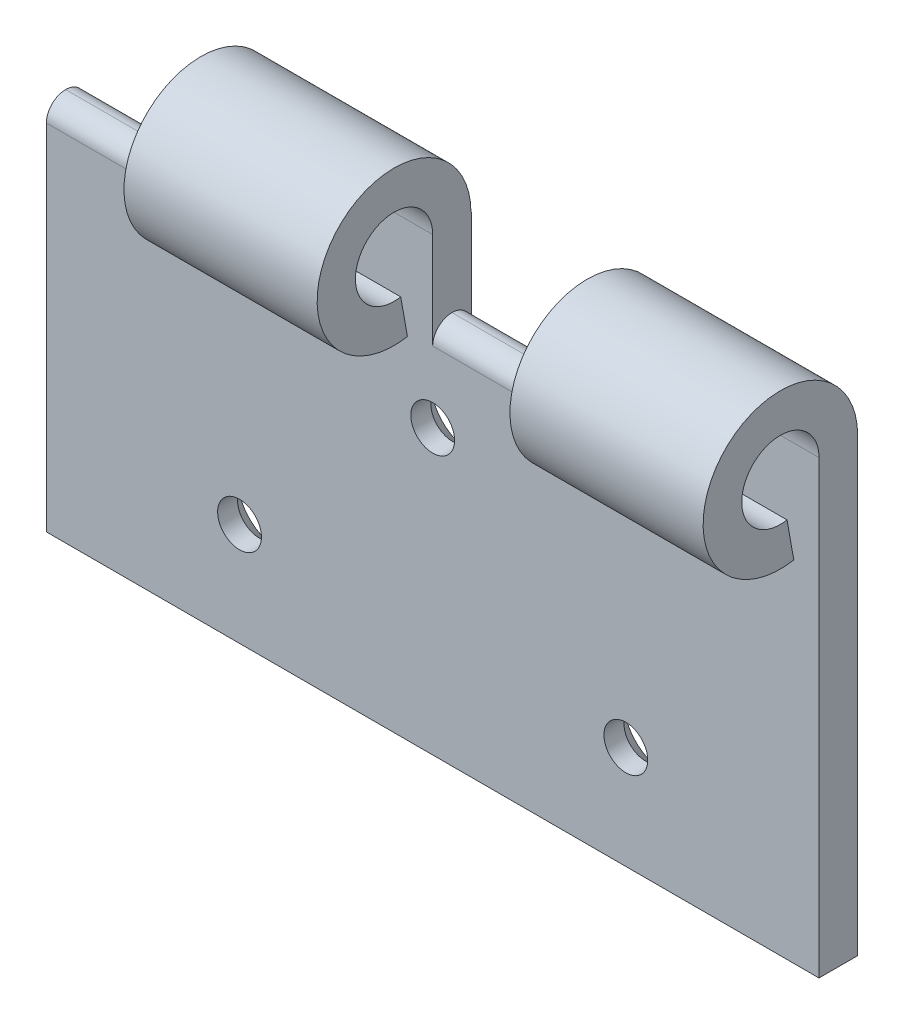
ISO-10303-21;
HEADER;
FILE_DESCRIPTION(('STEP AP214'),'2;1');
FILE_NAME('part.step','',(''),(''),'','','');
FILE_SCHEMA(('AUTOMOTIVE_DESIGN { 1 0 10303 214 1 1 1 1 }'));
ENDSEC;
DATA;
#1=APPLICATION_CONTEXT('core data for automotive mechanical design processes');
#2=APPLICATION_PROTOCOL_DEFINITION('international standard','automotive_design',2000,#1);
#3=PRODUCT_CONTEXT('',#1,'mechanical');
#4=PRODUCT('Part','Part','',(#3));
#5=PRODUCT_RELATED_PRODUCT_CATEGORY('part','',(#4));
#6=PRODUCT_DEFINITION_FORMATION('','',#4);
#7=PRODUCT_DEFINITION_CONTEXT('part definition',#1,'design');
#8=PRODUCT_DEFINITION('design','',#6,#7);
#9=PRODUCT_DEFINITION_SHAPE('','',#8);
#10=(LENGTH_UNIT() NAMED_UNIT(*) SI_UNIT(.MILLI.,.METRE.));
#11=(NAMED_UNIT(*) PLANE_ANGLE_UNIT() SI_UNIT($,.RADIAN.));
#12=(NAMED_UNIT(*) SI_UNIT($,.STERADIAN.) SOLID_ANGLE_UNIT());
#13=UNCERTAINTY_MEASURE_WITH_UNIT(LENGTH_MEASURE(1.E-05),#10,'distance_accuracy_value','');
#14=(GEOMETRIC_REPRESENTATION_CONTEXT(3) GLOBAL_UNCERTAINTY_ASSIGNED_CONTEXT((#13)) GLOBAL_UNIT_ASSIGNED_CONTEXT((#10,
#11,#12)) REPRESENTATION_CONTEXT('',''));
#15=CARTESIAN_POINT('',(0.,0.,0.));
#16=DIRECTION('',(0.,0.,1.));
#17=DIRECTION('',(1.,0.,0.));
#18=AXIS2_PLACEMENT_3D('',#15,#16,#17);
#19=CARTESIAN_POINT('',(0.,17.5,3.));
#20=DIRECTION('',(0.,1.,0.));
#21=DIRECTION('',(0.,0.,1.));
#22=AXIS2_PLACEMENT_3D('',#19,#20,#21);
#23=PLANE('',#22);
#24=DIRECTION('',(1.,0.,0.));
#25=VECTOR('',#24,1.);
#26=CARTESIAN_POINT('',(-15.,17.5,0.0271761223007237));
#27=LINE('',#26,#25);
#28=CARTESIAN_POINT('',(-15.,17.5,0.0271761223007237));
#29=VERTEX_POINT('',#28);
#30=CARTESIAN_POINT('',(0.,17.5,0.0271761223007237));
#31=VERTEX_POINT('',#30);
#32=EDGE_CURVE('E194',#29,#31,#27,.T.);
#33=ORIENTED_EDGE('',*,*,#32,.T.);
#34=DIRECTION('',(0.,0.,1.));
#35=VECTOR('',#34,1.);
#36=CARTESIAN_POINT('',(0.,17.5,3.));
#37=LINE('',#36,#35);
#38=CARTESIAN_POINT('',(0.,17.5,0.));
#39=VERTEX_POINT('',#38);
#40=EDGE_CURVE('E294',#39,#31,#37,.T.);
#41=ORIENTED_EDGE('',*,*,#40,.F.);
#42=DIRECTION('',(1.,0.,0.));
#43=VECTOR('',#42,1.);
#44=CARTESIAN_POINT('',(0.,17.5,0.));
#45=LINE('',#44,#43);
#46=CARTESIAN_POINT('',(-15.,17.5,0.));
#47=VERTEX_POINT('',#46);
#48=EDGE_CURVE('E178',#47,#39,#45,.T.);
#49=ORIENTED_EDGE('',*,*,#48,.F.);
#50=DIRECTION('',(0.,0.,1.));
#51=VECTOR('',#50,1.);
#52=CARTESIAN_POINT('',(-15.,17.5,0.));
#53=LINE('',#52,#51);
#54=EDGE_CURVE('E633',#47,#29,#53,.T.);
#55=ORIENTED_EDGE('',*,*,#54,.T.);
#56=EDGE_LOOP('',(#33,#41,#49,#55));
#57=FACE_BOUND('',#56,.T.);
#58=ADVANCED_FACE('F39',(#57),#23,.T.);
#59=CARTESIAN_POINT('',(0.,0.,3.));
#60=DIRECTION('',(0.,0.,1.));
#61=DIRECTION('',(1.,0.,0.));
#62=AXIS2_PLACEMENT_3D('',#59,#60,#61);
#63=PLANE('',#62);
#64=DIRECTION('',(0.,-1.,0.));
#65=VECTOR('',#64,1.);
#66=CARTESIAN_POINT('',(-15.,0.,3.));
#67=LINE('',#66,#65);
#68=CARTESIAN_POINT('',(-15.,17.5,3.));
#69=VERTEX_POINT('',#68);
#70=CARTESIAN_POINT('',(-15.,10.,3.));
#71=VERTEX_POINT('',#70);
#72=EDGE_CURVE('E169',#69,#71,#67,.T.);
#73=ORIENTED_EDGE('',*,*,#72,.T.);
#74=DIRECTION('',(1.,0.,0.));
#75=VECTOR('',#74,1.);
#76=CARTESIAN_POINT('',(0.,10.,3.));
#77=LINE('',#76,#75);
#78=CARTESIAN_POINT('',(-30.,10.,3.));
#79=VERTEX_POINT('',#78);
#80=EDGE_CURVE('E267',#71,#79,#77,.F.);
#81=ORIENTED_EDGE('',*,*,#80,.T.);
#82=DIRECTION('',(0.,1.,0.));
#83=VECTOR('',#82,1.);
#84=CARTESIAN_POINT('',(-30.,0.,3.));
#85=LINE('',#84,#83);
#86=CARTESIAN_POINT('',(-30.,-17.5,3.));
#87=VERTEX_POINT('',#86);
#88=EDGE_CURVE('E243',#87,#79,#85,.T.);
#89=ORIENTED_EDGE('',*,*,#88,.F.);
#90=DIRECTION('',(1.,0.,0.));
#91=VECTOR('',#90,1.);
#92=CARTESIAN_POINT('',(0.,-17.5,3.));
#93=LINE('',#92,#91);
#94=CARTESIAN_POINT('',(30.,-17.5,3.));
#95=VERTEX_POINT('',#94);
#96=EDGE_CURVE('E237',#87,#95,#93,.T.);
#97=ORIENTED_EDGE('',*,*,#96,.T.);
#98=DIRECTION('',(0.,1.,0.));
#99=VECTOR('',#98,1.);
#100=CARTESIAN_POINT('',(30.,0.,3.));
#101=LINE('',#100,#99);
#102=CARTESIAN_POINT('',(30.,17.5,3.));
#103=VERTEX_POINT('',#102);
#104=EDGE_CURVE('E240',#95,#103,#101,.T.);
#105=ORIENTED_EDGE('',*,*,#104,.T.);
#106=DIRECTION('',(1.,0.,0.));
#107=VECTOR('',#106,1.);
#108=CARTESIAN_POINT('',(15.,17.5,3.));
#109=LINE('',#108,#107);
#110=CARTESIAN_POINT('',(15.,17.5,3.));
#111=VERTEX_POINT('',#110);
#112=EDGE_CURVE('E203',#111,#103,#109,.T.);
#113=ORIENTED_EDGE('',*,*,#112,.F.);
#114=DIRECTION('',(0.,-1.,0.));
#115=VECTOR('',#114,1.);
#116=CARTESIAN_POINT('',(15.,17.5,3.));
#117=LINE('',#116,#115);
#118=CARTESIAN_POINT('',(15.,10.,3.));
#119=VERTEX_POINT('',#118);
#120=EDGE_CURVE('E170',#111,#119,#117,.T.);
#121=ORIENTED_EDGE('',*,*,#120,.T.);
#122=DIRECTION('',(-1.,0.,0.));
#123=VECTOR('',#122,1.);
#124=CARTESIAN_POINT('',(0.,10.,3.));
#125=LINE('',#124,#123);
#126=CARTESIAN_POINT('',(0.,10.,3.));
#127=VERTEX_POINT('',#126);
#128=EDGE_CURVE('E264',#119,#127,#125,.T.);
#129=ORIENTED_EDGE('',*,*,#128,.T.);
#130=DIRECTION('',(0.,-1.,0.));
#131=VECTOR('',#130,1.);
#132=CARTESIAN_POINT('',(0.,17.5,3.));
#133=LINE('',#132,#131);
#134=CARTESIAN_POINT('',(0.,17.5,3.));
#135=VERTEX_POINT('',#134);
#136=EDGE_CURVE('E279',#135,#127,#133,.T.);
#137=ORIENTED_EDGE('',*,*,#136,.F.);
#138=DIRECTION('',(1.,0.,0.));
#139=VECTOR('',#138,1.);
#140=CARTESIAN_POINT('',(-15.,17.5,3.));
#141=LINE('',#140,#139);
#142=EDGE_CURVE('E630',#69,#135,#141,.T.);
#143=ORIENTED_EDGE('',*,*,#142,.F.);
#144=EDGE_LOOP('',(#73,#81,#89,#97,#105,#113,#121,#129,#137,#143));
#145=FACE_BOUND('',#144,.T.);
#146=CARTESIAN_POINT('',(-15.,-9.5,3.));
#147=DIRECTION('',(0.,0.,1.));
#148=DIRECTION('',(1.,0.,0.));
#149=AXIS2_PLACEMENT_3D('',#146,#147,#148);
#150=CIRCLE('',#149,1.7);
#151=CARTESIAN_POINT('',(-13.3,-9.5,3.));
#152=VERTEX_POINT('',#151);
#153=EDGE_CURVE('E223',#152,#152,#150,.F.);
#154=ORIENTED_EDGE('',*,*,#153,.T.);
#155=EDGE_LOOP('',(#154));
#156=FACE_BOUND('',#155,.T.);
#157=CARTESIAN_POINT('',(15.,-9.5,3.));
#158=DIRECTION('',(0.,0.,1.));
#159=DIRECTION('',(1.,0.,0.));
#160=AXIS2_PLACEMENT_3D('',#157,#158,#159);
#161=CIRCLE('',#160,1.7);
#162=CARTESIAN_POINT('',(16.7,-9.5,3.));
#163=VERTEX_POINT('',#162);
#164=EDGE_CURVE('E232',#163,#163,#161,.F.);
#165=ORIENTED_EDGE('',*,*,#164,.T.);
#166=EDGE_LOOP('',(#165));
#167=FACE_BOUND('',#166,.T.);
#168=CARTESIAN_POINT('',(0.,4.5,3.));
#169=DIRECTION('',(0.,0.,1.));
#170=DIRECTION('',(1.,0.,0.));
#171=AXIS2_PLACEMENT_3D('',#168,#169,#170);
#172=CIRCLE('',#171,1.7);
#173=CARTESIAN_POINT('',(1.7,4.5,3.));
#174=VERTEX_POINT('',#173);
#175=EDGE_CURVE('E214',#174,#174,#172,.F.);
#176=ORIENTED_EDGE('',*,*,#175,.T.);
#177=EDGE_LOOP('',(#176));
#178=FACE_BOUND('',#177,.T.);
#179=ADVANCED_FACE('F299',(#145,#156,#167,#178),#63,.T.);
#180=CARTESIAN_POINT('',(-30.,0.,3.));
#181=DIRECTION('',(-1.,0.,0.));
#182=DIRECTION('',(0.,0.,1.));
#183=AXIS2_PLACEMENT_3D('',#180,#181,#182);
#184=PLANE('',#183);
#185=CARTESIAN_POINT('',(-30.,10.,1.5));
#186=DIRECTION('',(-1.,0.,0.));
#187=DIRECTION('',(0.,0.,1.));
#188=AXIS2_PLACEMENT_3D('',#185,#186,#187);
#189=CIRCLE('',#188,1.5);
#190=CARTESIAN_POINT('',(-30.,11.5,1.5));
#191=VERTEX_POINT('',#190);
#192=EDGE_CURVE('E260',#79,#191,#189,.T.);
#193=ORIENTED_EDGE('',*,*,#192,.T.);
#194=CARTESIAN_POINT('',(-30.,10.,1.5));
#195=DIRECTION('',(-1.,0.,0.));
#196=DIRECTION('',(0.,0.,1.));
#197=AXIS2_PLACEMENT_3D('',#194,#195,#196);
#198=CIRCLE('',#197,1.5);
#199=CARTESIAN_POINT('',(-30.,10.,0.));
#200=VERTEX_POINT('',#199);
#201=EDGE_CURVE('E262',#191,#200,#198,.T.);
#202=ORIENTED_EDGE('',*,*,#201,.T.);
#203=DIRECTION('',(0.,1.,0.));
#204=VECTOR('',#203,1.);
#205=CARTESIAN_POINT('',(-30.,0.,0.));
#206=LINE('',#205,#204);
#207=CARTESIAN_POINT('',(-30.,-17.5,0.));
#208=VERTEX_POINT('',#207);
#209=EDGE_CURVE('E241',#208,#200,#206,.T.);
#210=ORIENTED_EDGE('',*,*,#209,.F.);
#211=DIRECTION('',(0.,0.,-1.));
#212=VECTOR('',#211,1.);
#213=CARTESIAN_POINT('',(-30.,-17.5,3.));
#214=LINE('',#213,#212);
#215=EDGE_CURVE('E246',#87,#208,#214,.T.);
#216=ORIENTED_EDGE('',*,*,#215,.F.);
#217=ORIENTED_EDGE('',*,*,#88,.T.);
#218=EDGE_LOOP('',(#193,#202,#210,#216,#217));
#219=FACE_BOUND('',#218,.T.);
#220=ADVANCED_FACE('F325',(#219),#184,.T.);
#221=CARTESIAN_POINT('',(0.,0.,0.));
#222=DIRECTION('',(0.,0.,1.));
#223=DIRECTION('',(1.,0.,0.));
#224=AXIS2_PLACEMENT_3D('',#221,#222,#223);
#225=PLANE('',#224);
#226=CARTESIAN_POINT('',(15.,-9.5,0.));
#227=DIRECTION('',(0.,0.,-1.));
#228=DIRECTION('',(-1.,0.,0.));
#229=AXIS2_PLACEMENT_3D('',#226,#227,#228);
#230=CIRCLE('',#229,3.15);
#231=CARTESIAN_POINT('',(11.85,-9.5,0.));
#232=VERTEX_POINT('',#231);
#233=EDGE_CURVE('E222',#232,#232,#230,.T.);
#234=ORIENTED_EDGE('',*,*,#233,.F.);
#235=EDGE_LOOP('',(#234));
#236=FACE_BOUND('',#235,.T.);
#237=CARTESIAN_POINT('',(-15.,-9.5,0.));
#238=DIRECTION('',(0.,0.,-1.));
#239=DIRECTION('',(-1.,0.,0.));
#240=AXIS2_PLACEMENT_3D('',#237,#238,#239);
#241=CIRCLE('',#240,3.15);
#242=CARTESIAN_POINT('',(-18.15,-9.5,0.));
#243=VERTEX_POINT('',#242);
#244=EDGE_CURVE('E213',#243,#243,#241,.T.);
#245=ORIENTED_EDGE('',*,*,#244,.F.);
#246=EDGE_LOOP('',(#245));
#247=FACE_BOUND('',#246,.T.);
#248=CARTESIAN_POINT('',(0.,4.5,0.));
#249=DIRECTION('',(0.,0.,-1.));
#250=DIRECTION('',(-1.,0.,0.));
#251=AXIS2_PLACEMENT_3D('',#248,#249,#250);
#252=CIRCLE('',#251,3.15);
#253=CARTESIAN_POINT('',(-3.15,4.5,0.));
#254=VERTEX_POINT('',#253);
#255=EDGE_CURVE('E206',#254,#254,#252,.T.);
#256=ORIENTED_EDGE('',*,*,#255,.F.);
#257=EDGE_LOOP('',(#256));
#258=FACE_BOUND('',#257,.T.);
#259=ORIENTED_EDGE('',*,*,#209,.T.);
#260=DIRECTION('',(1.,0.,0.));
#261=VECTOR('',#260,1.);
#262=CARTESIAN_POINT('',(-15.,10.,0.));
#263=LINE('',#262,#261);
#264=CARTESIAN_POINT('',(-15.,10.,0.));
#265=VERTEX_POINT('',#264);
#266=EDGE_CURVE('E257',#200,#265,#263,.T.);
#267=ORIENTED_EDGE('',*,*,#266,.T.);
#268=DIRECTION('',(0.,-1.,0.));
#269=VECTOR('',#268,1.);
#270=CARTESIAN_POINT('',(-15.,0.,0.));
#271=LINE('',#270,#269);
#272=EDGE_CURVE('E625',#47,#265,#271,.T.);
#273=ORIENTED_EDGE('',*,*,#272,.F.);
#274=ORIENTED_EDGE('',*,*,#48,.T.);
#275=DIRECTION('',(0.,1.,0.));
#276=VECTOR('',#275,1.);
#277=CARTESIAN_POINT('',(0.,17.5,0.));
#278=LINE('',#277,#276);
#279=CARTESIAN_POINT('',(0.,10.,0.));
#280=VERTEX_POINT('',#279);
#281=EDGE_CURVE('E284',#280,#39,#278,.T.);
#282=ORIENTED_EDGE('',*,*,#281,.F.);
#283=DIRECTION('',(-1.,0.,0.));
#284=VECTOR('',#283,1.);
#285=CARTESIAN_POINT('',(15.,10.,0.));
#286=LINE('',#285,#284);
#287=CARTESIAN_POINT('',(15.,10.,0.));
#288=VERTEX_POINT('',#287);
#289=EDGE_CURVE('E167',#280,#288,#286,.F.);
#290=ORIENTED_EDGE('',*,*,#289,.T.);
#291=DIRECTION('',(0.,1.,0.));
#292=VECTOR('',#291,1.);
#293=CARTESIAN_POINT('',(15.,17.5,0.));
#294=LINE('',#293,#292);
#295=CARTESIAN_POINT('',(15.,17.5,0.));
#296=VERTEX_POINT('',#295);
#297=EDGE_CURVE('E160',#288,#296,#294,.T.);
#298=ORIENTED_EDGE('',*,*,#297,.T.);
#299=CARTESIAN_POINT('',(30.,17.5,0.));
#300=VERTEX_POINT('',#299);
#301=EDGE_CURVE('E164',#296,#300,#45,.T.);
#302=ORIENTED_EDGE('',*,*,#301,.T.);
#303=DIRECTION('',(0.,1.,0.));
#304=VECTOR('',#303,1.);
#305=CARTESIAN_POINT('',(30.,0.,0.));
#306=LINE('',#305,#304);
#307=CARTESIAN_POINT('',(30.,-17.5,0.));
#308=VERTEX_POINT('',#307);
#309=EDGE_CURVE('E179',#308,#300,#306,.T.);
#310=ORIENTED_EDGE('',*,*,#309,.F.);
#311=DIRECTION('',(1.,0.,0.));
#312=VECTOR('',#311,1.);
#313=CARTESIAN_POINT('',(0.,-17.5,0.));
#314=LINE('',#313,#312);
#315=EDGE_CURVE('E231',#208,#308,#314,.T.);
#316=ORIENTED_EDGE('',*,*,#315,.F.);
#317=EDGE_LOOP('',(#259,#267,#273,#274,#282,#290,#298,#302,#310,#316));
#318=FACE_BOUND('',#317,.T.);
#319=ADVANCED_FACE('F163',(#236,#247,#258,#318),#225,.F.);
#320=CARTESIAN_POINT('',(0.,-17.5,3.));
#321=DIRECTION('',(0.,1.,0.));
#322=DIRECTION('',(0.,0.,1.));
#323=AXIS2_PLACEMENT_3D('',#320,#321,#322);
#324=PLANE('',#323);
#325=ORIENTED_EDGE('',*,*,#315,.T.);
#326=DIRECTION('',(0.,0.,-1.));
#327=VECTOR('',#326,1.);
#328=CARTESIAN_POINT('',(30.,-17.5,3.));
#329=LINE('',#328,#327);
#330=EDGE_CURVE('E253',#95,#308,#329,.T.);
#331=ORIENTED_EDGE('',*,*,#330,.F.);
#332=ORIENTED_EDGE('',*,*,#96,.F.);
#333=ORIENTED_EDGE('',*,*,#215,.T.);
#334=EDGE_LOOP('',(#325,#331,#332,#333));
#335=FACE_BOUND('',#334,.T.);
#336=ADVANCED_FACE('F334',(#335),#324,.F.);
#337=CARTESIAN_POINT('',(30.,0.,3.));
#338=DIRECTION('',(-1.,0.,0.));
#339=DIRECTION('',(0.,0.,1.));
#340=AXIS2_PLACEMENT_3D('',#337,#338,#339);
#341=PLANE('',#340);
#342=CARTESIAN_POINT('',(30.,17.5,6.));
#343=DIRECTION('',(-1.,0.,0.));
#344=DIRECTION('',(0.,0.,-1.));
#345=AXIS2_PLACEMENT_3D('',#342,#343,#344);
#346=CIRCLE('',#345,3.);
#347=CARTESIAN_POINT('',(30.,14.5455767409634,5.47905546699919));
#348=VERTEX_POINT('',#347);
#349=EDGE_CURVE('E186',#348,#103,#346,.T.);
#350=ORIENTED_EDGE('',*,*,#349,.T.);
#351=ORIENTED_EDGE('',*,*,#104,.F.);
#352=ORIENTED_EDGE('',*,*,#330,.T.);
#353=ORIENTED_EDGE('',*,*,#309,.T.);
#354=CARTESIAN_POINT('',(30.,17.5,6.));
#355=DIRECTION('',(1.,0.,0.));
#356=DIRECTION('',(0.,0.,-1.));
#357=AXIS2_PLACEMENT_3D('',#354,#355,#356);
#358=CIRCLE('',#357,6.);
#359=CARTESIAN_POINT('',(30.,11.5911534819268,4.95811093399839));
#360=VERTEX_POINT('',#359);
#361=EDGE_CURVE('E177',#300,#360,#358,.T.);
#362=ORIENTED_EDGE('',*,*,#361,.T.);
#363=DIRECTION('',(0.,0.984807753012207,0.173648177666934));
#364=VECTOR('',#363,1.);
#365=CARTESIAN_POINT('',(30.,14.5455767409634,5.47905546699919));
#366=LINE('',#365,#364);
#367=EDGE_CURVE('E191',#360,#348,#366,.T.);
#368=ORIENTED_EDGE('',*,*,#367,.T.);
#369=EDGE_LOOP('',(#350,#351,#352,#353,#362,#368));
#370=FACE_BOUND('',#369,.T.);
#371=ADVANCED_FACE('F305',(#370),#341,.F.);
#372=CARTESIAN_POINT('',(15.,-9.5,0.));
#373=DIRECTION('',(0.,0.,-1.));
#374=DIRECTION('',(-1.,0.,0.));
#375=AXIS2_PLACEMENT_3D('',#372,#373,#374);
#376=CYLINDRICAL_SURFACE('',#375,1.7);
#377=ORIENTED_EDGE('',*,*,#164,.F.);
#378=EDGE_LOOP('',(#377));
#379=FACE_BOUND('',#378,.T.);
#380=CARTESIAN_POINT('',(15.,-9.5,1.45));
#381=DIRECTION('',(0.,0.,-1.));
#382=DIRECTION('',(-1.,0.,0.));
#383=AXIS2_PLACEMENT_3D('',#380,#381,#382);
#384=CIRCLE('',#383,1.7);
#385=CARTESIAN_POINT('',(13.3,-9.5,1.45));
#386=VERTEX_POINT('',#385);
#387=EDGE_CURVE('E228',#386,#386,#384,.T.);
#388=ORIENTED_EDGE('',*,*,#387,.T.);
#389=EDGE_LOOP('',(#388));
#390=FACE_BOUND('',#389,.T.);
#391=ADVANCED_FACE('F333',(#379,#390),#376,.F.);
#392=CARTESIAN_POINT('',(15.,-9.5,0.));
#393=DIRECTION('',(0.,0.,-1.));
#394=DIRECTION('',(-1.,0.,0.));
#395=AXIS2_PLACEMENT_3D('',#392,#393,#394);
#396=CONICAL_SURFACE('',#395,3.15,0.785398163397448);
#397=ORIENTED_EDGE('',*,*,#387,.F.);
#398=EDGE_LOOP('',(#397));
#399=FACE_BOUND('',#398,.T.);
#400=ORIENTED_EDGE('',*,*,#233,.T.);
#401=EDGE_LOOP('',(#400));
#402=FACE_BOUND('',#401,.T.);
#403=ADVANCED_FACE('F556',(#399,#402),#396,.F.);
#404=CARTESIAN_POINT('',(-15.,-9.5,0.));
#405=DIRECTION('',(0.,0.,-1.));
#406=DIRECTION('',(-1.,0.,0.));
#407=AXIS2_PLACEMENT_3D('',#404,#405,#406);
#408=CYLINDRICAL_SURFACE('',#407,1.7);
#409=ORIENTED_EDGE('',*,*,#153,.F.);
#410=EDGE_LOOP('',(#409));
#411=FACE_BOUND('',#410,.T.);
#412=CARTESIAN_POINT('',(-15.,-9.5,1.45));
#413=DIRECTION('',(0.,0.,-1.));
#414=DIRECTION('',(-1.,0.,0.));
#415=AXIS2_PLACEMENT_3D('',#412,#413,#414);
#416=CIRCLE('',#415,1.7);
#417=CARTESIAN_POINT('',(-16.7,-9.5,1.45));
#418=VERTEX_POINT('',#417);
#419=EDGE_CURVE('E219',#418,#418,#416,.T.);
#420=ORIENTED_EDGE('',*,*,#419,.T.);
#421=EDGE_LOOP('',(#420));
#422=FACE_BOUND('',#421,.T.);
#423=ADVANCED_FACE('F545',(#411,#422),#408,.F.);
#424=CARTESIAN_POINT('',(-15.,-9.5,0.));
#425=DIRECTION('',(0.,0.,-1.));
#426=DIRECTION('',(-1.,0.,0.));
#427=AXIS2_PLACEMENT_3D('',#424,#425,#426);
#428=CONICAL_SURFACE('',#427,3.15,0.785398163397448);
#429=ORIENTED_EDGE('',*,*,#419,.F.);
#430=EDGE_LOOP('',(#429));
#431=FACE_BOUND('',#430,.T.);
#432=ORIENTED_EDGE('',*,*,#244,.T.);
#433=EDGE_LOOP('',(#432));
#434=FACE_BOUND('',#433,.T.);
#435=ADVANCED_FACE('F534',(#431,#434),#428,.F.);
#436=CARTESIAN_POINT('',(0.,4.5,0.));
#437=DIRECTION('',(0.,0.,-1.));
#438=DIRECTION('',(-1.,0.,0.));
#439=AXIS2_PLACEMENT_3D('',#436,#437,#438);
#440=CYLINDRICAL_SURFACE('',#439,1.7);
#441=ORIENTED_EDGE('',*,*,#175,.F.);
#442=EDGE_LOOP('',(#441));
#443=FACE_BOUND('',#442,.T.);
#444=CARTESIAN_POINT('',(0.,4.5,1.45));
#445=DIRECTION('',(0.,0.,-1.));
#446=DIRECTION('',(-1.,0.,0.));
#447=AXIS2_PLACEMENT_3D('',#444,#445,#446);
#448=CIRCLE('',#447,1.7);
#449=CARTESIAN_POINT('',(-1.7,4.5,1.45));
#450=VERTEX_POINT('',#449);
#451=EDGE_CURVE('E210',#450,#450,#448,.T.);
#452=ORIENTED_EDGE('',*,*,#451,.T.);
#453=EDGE_LOOP('',(#452));
#454=FACE_BOUND('',#453,.T.);
#455=ADVANCED_FACE('F523',(#443,#454),#440,.F.);
#456=CARTESIAN_POINT('',(0.,4.5,0.));
#457=DIRECTION('',(0.,0.,-1.));
#458=DIRECTION('',(-1.,0.,0.));
#459=AXIS2_PLACEMENT_3D('',#456,#457,#458);
#460=CONICAL_SURFACE('',#459,3.15,0.785398163397448);
#461=ORIENTED_EDGE('',*,*,#451,.F.);
#462=EDGE_LOOP('',(#461));
#463=FACE_BOUND('',#462,.T.);
#464=ORIENTED_EDGE('',*,*,#255,.T.);
#465=EDGE_LOOP('',(#464));
#466=FACE_BOUND('',#465,.T.);
#467=ADVANCED_FACE('F451',(#463,#466),#460,.F.);
#468=CARTESIAN_POINT('',(15.,17.5,6.));
#469=DIRECTION('',(1.,0.,0.));
#470=DIRECTION('',(0.,0.,-1.));
#471=AXIS2_PLACEMENT_3D('',#468,#469,#470);
#472=CYLINDRICAL_SURFACE('',#471,6.);
#473=ORIENTED_EDGE('',*,*,#301,.F.);
#474=CARTESIAN_POINT('',(15.,17.5,6.));
#475=DIRECTION('',(1.,0.,0.));
#476=DIRECTION('',(0.,0.,-1.));
#477=AXIS2_PLACEMENT_3D('',#474,#475,#476);
#478=CIRCLE('',#477,6.);
#479=CARTESIAN_POINT('',(15.,11.5911534819268,4.95811093399839));
#480=VERTEX_POINT('',#479);
#481=EDGE_CURVE('E175',#296,#480,#478,.T.);
#482=ORIENTED_EDGE('',*,*,#481,.T.);
#483=DIRECTION('',(1.,0.,0.));
#484=VECTOR('',#483,1.);
#485=CARTESIAN_POINT('',(15.,11.5911534819268,4.95811093399839));
#486=LINE('',#485,#484);
#487=EDGE_CURVE('E199',#480,#360,#486,.T.);
#488=ORIENTED_EDGE('',*,*,#487,.T.);
#489=ORIENTED_EDGE('',*,*,#361,.F.);
#490=EDGE_LOOP('',(#473,#482,#488,#489));
#491=FACE_BOUND('',#490,.T.);
#492=ADVANCED_FACE('F173',(#491),#472,.T.);
#493=CARTESIAN_POINT('',(15.,17.5,6.));
#494=DIRECTION('',(1.,0.,0.));
#495=DIRECTION('',(0.,0.,-1.));
#496=AXIS2_PLACEMENT_3D('',#493,#494,#495);
#497=CYLINDRICAL_SURFACE('',#496,3.);
#498=ORIENTED_EDGE('',*,*,#349,.F.);
#499=DIRECTION('',(1.,0.,0.));
#500=VECTOR('',#499,1.);
#501=CARTESIAN_POINT('',(15.,14.5455767409634,5.47905546699919));
#502=LINE('',#501,#500);
#503=CARTESIAN_POINT('',(15.,14.5455767409634,5.47905546699919));
#504=VERTEX_POINT('',#503);
#505=EDGE_CURVE('E207',#504,#348,#502,.T.);
#506=ORIENTED_EDGE('',*,*,#505,.F.);
#507=CARTESIAN_POINT('',(15.,17.5,6.));
#508=DIRECTION('',(-1.,0.,0.));
#509=DIRECTION('',(0.,0.,-1.));
#510=AXIS2_PLACEMENT_3D('',#507,#508,#509);
#511=CIRCLE('',#510,3.);
#512=EDGE_CURVE('E188',#504,#111,#511,.T.);
#513=ORIENTED_EDGE('',*,*,#512,.T.);
#514=ORIENTED_EDGE('',*,*,#112,.T.);
#515=EDGE_LOOP('',(#498,#506,#513,#514));
#516=FACE_BOUND('',#515,.T.);
#517=ADVANCED_FACE('F298',(#516),#497,.F.);
#518=CARTESIAN_POINT('',(15.,14.5455767409634,5.47905546699919));
#519=DIRECTION('',(0.,0.173648177666934,-0.984807753012207));
#520=DIRECTION('',(0.,0.984807753012207,0.173648177666934));
#521=AXIS2_PLACEMENT_3D('',#518,#519,#520);
#522=PLANE('',#521);
#523=ORIENTED_EDGE('',*,*,#367,.F.);
#524=ORIENTED_EDGE('',*,*,#487,.F.);
#525=DIRECTION('',(0.,0.984807753012207,0.173648177666934));
#526=VECTOR('',#525,1.);
#527=CARTESIAN_POINT('',(15.,14.5455767409634,5.47905546699919));
#528=LINE('',#527,#526);
#529=EDGE_CURVE('E185',#480,#504,#528,.T.);
#530=ORIENTED_EDGE('',*,*,#529,.T.);
#531=ORIENTED_EDGE('',*,*,#505,.T.);
#532=EDGE_LOOP('',(#523,#524,#530,#531));
#533=FACE_BOUND('',#532,.T.);
#534=ADVANCED_FACE('F308',(#533),#522,.T.);
#535=CARTESIAN_POINT('',(15.,17.5,6.));
#536=DIRECTION('',(1.,0.,0.));
#537=DIRECTION('',(0.,0.,-1.));
#538=AXIS2_PLACEMENT_3D('',#535,#536,#537);
#539=PLANE('',#538);
#540=ORIENTED_EDGE('',*,*,#481,.F.);
#541=ORIENTED_EDGE('',*,*,#297,.F.);
#542=CARTESIAN_POINT('',(15.,10.,1.5));
#543=DIRECTION('',(1.,0.,0.));
#544=DIRECTION('',(0.,0.,-1.));
#545=AXIS2_PLACEMENT_3D('',#542,#543,#544);
#546=CIRCLE('',#545,1.5);
#547=CARTESIAN_POINT('',(15.,11.5,1.5));
#548=VERTEX_POINT('',#547);
#549=EDGE_CURVE('E55',#288,#548,#546,.T.);
#550=ORIENTED_EDGE('',*,*,#549,.T.);
#551=CARTESIAN_POINT('',(15.,10.,1.5));
#552=DIRECTION('',(1.,0.,0.));
#553=DIRECTION('',(0.,0.,-1.));
#554=AXIS2_PLACEMENT_3D('',#551,#552,#553);
#555=CIRCLE('',#554,1.5);
#556=EDGE_CURVE('E12',#548,#119,#555,.T.);
#557=ORIENTED_EDGE('',*,*,#556,.T.);
#558=ORIENTED_EDGE('',*,*,#120,.F.);
#559=ORIENTED_EDGE('',*,*,#512,.F.);
#560=ORIENTED_EDGE('',*,*,#529,.F.);
#561=EDGE_LOOP('',(#540,#541,#550,#557,#558,#559,#560));
#562=FACE_BOUND('',#561,.T.);
#563=ADVANCED_FACE('F182',(#562),#539,.F.);
#564=CARTESIAN_POINT('',(-15.,-0.498370861853703,2.82640160825805));
#565=DIRECTION('',(0.,-0.173648177666934,0.984807753012207));
#566=DIRECTION('',(0.,-0.984807753012208,-0.173648177666934));
#567=AXIS2_PLACEMENT_3D('',#564,#565,#566);
#568=PLANE('',#567);
#569=DIRECTION('',(0.,-0.984807753012208,-0.173648177666934));
#570=VECTOR('',#569,1.);
#571=CARTESIAN_POINT('',(0.,-0.498370861853703,2.82640160825805));
#572=LINE('',#571,#570);
#573=CARTESIAN_POINT('',(0.,14.5455767409634,5.47905546699919));
#574=VERTEX_POINT('',#573);
#575=CARTESIAN_POINT('',(0.,11.6179167378653,4.96283001811197));
#576=VERTEX_POINT('',#575);
#577=EDGE_CURVE('E636',#574,#576,#572,.T.);
#578=ORIENTED_EDGE('',*,*,#577,.T.);
#579=DIRECTION('',(1.,0.,0.));
#580=VECTOR('',#579,1.);
#581=CARTESIAN_POINT('',(-15.,11.6179167378653,4.96283001811197));
#582=LINE('',#581,#580);
#583=CARTESIAN_POINT('',(-15.,11.6179167378653,4.96283001811197));
#584=VERTEX_POINT('',#583);
#585=EDGE_CURVE('E656',#584,#576,#582,.T.);
#586=ORIENTED_EDGE('',*,*,#585,.F.);
#587=DIRECTION('',(0.,-0.984807753012208,-0.173648177666934));
#588=VECTOR('',#587,1.);
#589=CARTESIAN_POINT('',(-15.,-0.498370861853703,2.82640160825805));
#590=LINE('',#589,#588);
#591=CARTESIAN_POINT('',(-15.,14.5455767409634,5.47905546699919));
#592=VERTEX_POINT('',#591);
#593=EDGE_CURVE('E643',#592,#584,#590,.T.);
#594=ORIENTED_EDGE('',*,*,#593,.F.);
#595=DIRECTION('',(1.,0.,0.));
#596=VECTOR('',#595,1.);
#597=CARTESIAN_POINT('',(-15.,14.5455767409634,5.47905546699919));
#598=LINE('',#597,#596);
#599=EDGE_CURVE('E650',#592,#574,#598,.T.);
#600=ORIENTED_EDGE('',*,*,#599,.T.);
#601=EDGE_LOOP('',(#578,#586,#594,#600));
#602=FACE_BOUND('',#601,.T.);
#603=ADVANCED_FACE('F315',(#602),#568,.F.);
#604=CARTESIAN_POINT('',(-15.,17.5,6.));
#605=DIRECTION('',(1.,0.,0.));
#606=DIRECTION('',(0.,0.,-1.));
#607=AXIS2_PLACEMENT_3D('',#604,#605,#606);
#608=CYLINDRICAL_SURFACE('',#607,5.97282387769928);
#609=ORIENTED_EDGE('',*,*,#32,.F.);
#610=CARTESIAN_POINT('',(-15.,17.5,6.));
#611=DIRECTION('',(1.,0.,0.));
#612=DIRECTION('',(0.,0.,-1.));
#613=AXIS2_PLACEMENT_3D('',#610,#611,#612);
#614=CIRCLE('',#613,5.97282387769928);
#615=EDGE_CURVE('E649',#584,#29,#614,.F.);
#616=ORIENTED_EDGE('',*,*,#615,.F.);
#617=ORIENTED_EDGE('',*,*,#585,.T.);
#618=CARTESIAN_POINT('',(0.,17.5,6.));
#619=DIRECTION('',(1.,0.,0.));
#620=DIRECTION('',(0.,0.,-1.));
#621=AXIS2_PLACEMENT_3D('',#618,#619,#620);
#622=CIRCLE('',#621,5.97282387769928);
#623=EDGE_CURVE('E647',#576,#31,#622,.F.);
#624=ORIENTED_EDGE('',*,*,#623,.T.);
#625=EDGE_LOOP('',(#609,#616,#617,#624));
#626=FACE_BOUND('',#625,.T.);
#627=ADVANCED_FACE('F381',(#626),#608,.T.);
#628=CARTESIAN_POINT('',(-15.,17.5,6.));
#629=DIRECTION('',(1.,0.,0.));
#630=DIRECTION('',(0.,0.,-1.));
#631=AXIS2_PLACEMENT_3D('',#628,#629,#630);
#632=CYLINDRICAL_SURFACE('',#631,3.);
#633=CARTESIAN_POINT('',(0.,17.5,6.));
#634=DIRECTION('',(1.,0.,0.));
#635=DIRECTION('',(0.,0.,-1.));
#636=AXIS2_PLACEMENT_3D('',#633,#634,#635);
#637=CIRCLE('',#636,3.);
#638=EDGE_CURVE('E639',#574,#135,#637,.F.);
#639=ORIENTED_EDGE('',*,*,#638,.F.);
#640=ORIENTED_EDGE('',*,*,#599,.F.);
#641=CARTESIAN_POINT('',(-15.,17.5,6.));
#642=DIRECTION('',(1.,0.,0.));
#643=DIRECTION('',(0.,0.,-1.));
#644=AXIS2_PLACEMENT_3D('',#641,#642,#643);
#645=CIRCLE('',#644,3.);
#646=EDGE_CURVE('E646',#592,#69,#645,.F.);
#647=ORIENTED_EDGE('',*,*,#646,.T.);
#648=ORIENTED_EDGE('',*,*,#142,.T.);
#649=EDGE_LOOP('',(#639,#640,#647,#648));
#650=FACE_BOUND('',#649,.T.);
#651=ADVANCED_FACE('F372',(#650),#632,.F.);
#652=CARTESIAN_POINT('',(-15.,0.,0.));
#653=DIRECTION('',(1.,0.,0.));
#654=DIRECTION('',(0.,0.,-1.));
#655=AXIS2_PLACEMENT_3D('',#652,#653,#654);
#656=PLANE('',#655);
#657=ORIENTED_EDGE('',*,*,#615,.T.);
#658=ORIENTED_EDGE('',*,*,#54,.F.);
#659=ORIENTED_EDGE('',*,*,#272,.T.);
#660=CARTESIAN_POINT('',(-15.,10.,1.5));
#661=DIRECTION('',(1.,0.,0.));
#662=DIRECTION('',(0.,0.,-1.));
#663=AXIS2_PLACEMENT_3D('',#660,#661,#662);
#664=CIRCLE('',#663,1.5);
#665=CARTESIAN_POINT('',(-15.,11.5,1.5));
#666=VERTEX_POINT('',#665);
#667=EDGE_CURVE('E269',#265,#666,#664,.T.);
#668=ORIENTED_EDGE('',*,*,#667,.T.);
#669=CARTESIAN_POINT('',(-15.,10.,1.5));
#670=DIRECTION('',(1.,0.,0.));
#671=DIRECTION('',(0.,0.,-1.));
#672=AXIS2_PLACEMENT_3D('',#669,#670,#671);
#673=CIRCLE('',#672,1.5);
#674=EDGE_CURVE('E271',#666,#71,#673,.T.);
#675=ORIENTED_EDGE('',*,*,#674,.T.);
#676=ORIENTED_EDGE('',*,*,#72,.F.);
#677=ORIENTED_EDGE('',*,*,#646,.F.);
#678=ORIENTED_EDGE('',*,*,#593,.T.);
#679=EDGE_LOOP('',(#657,#658,#659,#668,#675,#676,#677,#678));
#680=FACE_BOUND('',#679,.T.);
#681=ADVANCED_FACE('F365',(#680),#656,.F.);
#682=CARTESIAN_POINT('',(0.,0.,0.));
#683=DIRECTION('',(1.,0.,0.));
#684=DIRECTION('',(0.,0.,-1.));
#685=AXIS2_PLACEMENT_3D('',#682,#683,#684);
#686=PLANE('',#685);
#687=ORIENTED_EDGE('',*,*,#638,.T.);
#688=ORIENTED_EDGE('',*,*,#136,.T.);
#689=CARTESIAN_POINT('',(0.,10.,1.5));
#690=DIRECTION('',(1.,0.,0.));
#691=DIRECTION('',(0.,0.,-1.));
#692=AXIS2_PLACEMENT_3D('',#689,#690,#691);
#693=CIRCLE('',#692,1.5);
#694=CARTESIAN_POINT('',(0.,11.5,1.5));
#695=VERTEX_POINT('',#694);
#696=EDGE_CURVE('E48',#127,#695,#693,.F.);
#697=ORIENTED_EDGE('',*,*,#696,.T.);
#698=CARTESIAN_POINT('',(0.,10.,1.5));
#699=DIRECTION('',(1.,0.,0.));
#700=DIRECTION('',(0.,0.,-1.));
#701=AXIS2_PLACEMENT_3D('',#698,#699,#700);
#702=CIRCLE('',#701,1.5);
#703=EDGE_CURVE('E274',#695,#280,#702,.F.);
#704=ORIENTED_EDGE('',*,*,#703,.T.);
#705=ORIENTED_EDGE('',*,*,#281,.T.);
#706=ORIENTED_EDGE('',*,*,#40,.T.);
#707=ORIENTED_EDGE('',*,*,#623,.F.);
#708=ORIENTED_EDGE('',*,*,#577,.F.);
#709=EDGE_LOOP('',(#687,#688,#697,#704,#705,#706,#707,#708));
#710=FACE_BOUND('',#709,.T.);
#711=ADVANCED_FACE('F343',(#710),#686,.T.);
#712=CARTESIAN_POINT('',(-30.,10.,1.5));
#713=DIRECTION('',(1.,0.,0.));
#714=DIRECTION('',(0.,0.,-1.));
#715=AXIS2_PLACEMENT_3D('',#712,#713,#714);
#716=CYLINDRICAL_SURFACE('',#715,1.5);
#717=DIRECTION('',(1.,0.,0.));
#718=VECTOR('',#717,1.);
#719=CARTESIAN_POINT('',(-30.,11.5,1.5));
#720=LINE('',#719,#718);
#721=EDGE_CURVE('E277',#191,#666,#720,.T.);
#722=ORIENTED_EDGE('',*,*,#721,.F.);
#723=ORIENTED_EDGE('',*,*,#192,.F.);
#724=ORIENTED_EDGE('',*,*,#80,.F.);
#725=ORIENTED_EDGE('',*,*,#674,.F.);
#726=EDGE_LOOP('',(#722,#723,#724,#725));
#727=FACE_BOUND('',#726,.T.);
#728=ADVANCED_FACE('F341',(#727),#716,.T.);
#729=CARTESIAN_POINT('',(0.,10.,1.5));
#730=DIRECTION('',(-1.,0.,0.));
#731=DIRECTION('',(0.,0.,1.));
#732=AXIS2_PLACEMENT_3D('',#729,#730,#731);
#733=CYLINDRICAL_SURFACE('',#732,1.5);
#734=ORIENTED_EDGE('',*,*,#201,.F.);
#735=ORIENTED_EDGE('',*,*,#721,.T.);
#736=ORIENTED_EDGE('',*,*,#667,.F.);
#737=ORIENTED_EDGE('',*,*,#266,.F.);
#738=EDGE_LOOP('',(#734,#735,#736,#737));
#739=FACE_BOUND('',#738,.T.);
#740=ADVANCED_FACE('F338',(#739),#733,.T.);
#741=CARTESIAN_POINT('',(0.,10.,1.5));
#742=DIRECTION('',(-1.,0.,0.));
#743=DIRECTION('',(0.,0.,1.));
#744=AXIS2_PLACEMENT_3D('',#741,#742,#743);
#745=CYLINDRICAL_SURFACE('',#744,1.5);
#746=ORIENTED_EDGE('',*,*,#128,.F.);
#747=ORIENTED_EDGE('',*,*,#556,.F.);
#748=DIRECTION('',(-1.,0.,0.));
#749=VECTOR('',#748,1.);
#750=CARTESIAN_POINT('',(15.,11.5,1.5));
#751=LINE('',#750,#749);
#752=EDGE_CURVE('E43',#695,#548,#751,.F.);
#753=ORIENTED_EDGE('',*,*,#752,.F.);
#754=ORIENTED_EDGE('',*,*,#696,.F.);
#755=EDGE_LOOP('',(#746,#747,#753,#754));
#756=FACE_BOUND('',#755,.T.);
#757=ADVANCED_FACE('F41',(#756),#745,.T.);
#758=CARTESIAN_POINT('',(15.,10.,1.5));
#759=DIRECTION('',(1.,0.,0.));
#760=DIRECTION('',(0.,0.,-1.));
#761=AXIS2_PLACEMENT_3D('',#758,#759,#760);
#762=CYLINDRICAL_SURFACE('',#761,1.5);
#763=ORIENTED_EDGE('',*,*,#549,.F.);
#764=ORIENTED_EDGE('',*,*,#289,.F.);
#765=ORIENTED_EDGE('',*,*,#703,.F.);
#766=ORIENTED_EDGE('',*,*,#752,.T.);
#767=EDGE_LOOP('',(#763,#764,#765,#766));
#768=FACE_BOUND('',#767,.T.);
#769=ADVANCED_FACE('F289',(#768),#762,.T.);
#770=CLOSED_SHELL('',(#58,#179,#220,#319,#336,#371,#391,#403,#423,#435,#455,#467,#492,#517,#534,
#563,#603,#627,#651,#681,#711,#728,#740,#757,#769));
#771=MANIFOLD_SOLID_BREP('B2',#770);
#772=ADVANCED_BREP_SHAPE_REPRESENTATION('',(#18,#771),#14);
#773=SHAPE_DEFINITION_REPRESENTATION(#9,#772);
ENDSEC;
END-ISO-10303-21;
